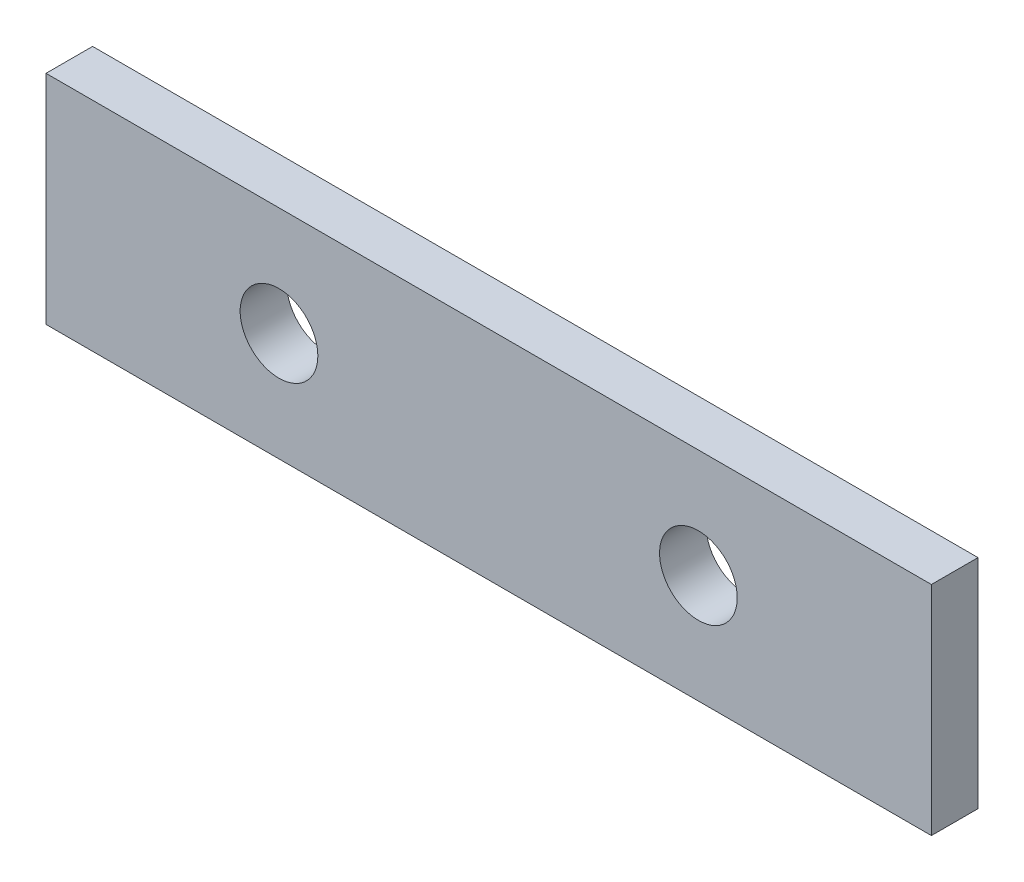
ISO-10303-21;
HEADER;
FILE_DESCRIPTION(('STEP AP214'),'2;1');
FILE_NAME('part.step','',(''),(''),'','','');
FILE_SCHEMA(('AUTOMOTIVE_DESIGN { 1 0 10303 214 1 1 1 1 }'));
ENDSEC;
DATA;
#1=APPLICATION_CONTEXT('core data for automotive mechanical design processes');
#2=APPLICATION_PROTOCOL_DEFINITION('international standard','automotive_design',2000,#1);
#3=PRODUCT_CONTEXT('',#1,'mechanical');
#4=PRODUCT('Part','Part','',(#3));
#5=PRODUCT_RELATED_PRODUCT_CATEGORY('part','',(#4));
#6=PRODUCT_DEFINITION_FORMATION('','',#4);
#7=PRODUCT_DEFINITION_CONTEXT('part definition',#1,'design');
#8=PRODUCT_DEFINITION('design','',#6,#7);
#9=PRODUCT_DEFINITION_SHAPE('','',#8);
#10=(LENGTH_UNIT() NAMED_UNIT(*) SI_UNIT(.MILLI.,.METRE.));
#11=(NAMED_UNIT(*) PLANE_ANGLE_UNIT() SI_UNIT($,.RADIAN.));
#12=(NAMED_UNIT(*) SI_UNIT($,.STERADIAN.) SOLID_ANGLE_UNIT());
#13=UNCERTAINTY_MEASURE_WITH_UNIT(LENGTH_MEASURE(1.E-05),#10,'distance_accuracy_value','');
#14=(GEOMETRIC_REPRESENTATION_CONTEXT(3) GLOBAL_UNCERTAINTY_ASSIGNED_CONTEXT((#13)) GLOBAL_UNIT_ASSIGNED_CONTEXT((#10,
#11,#12)) REPRESENTATION_CONTEXT('',''));
#15=CARTESIAN_POINT('',(0.,0.,0.));
#16=DIRECTION('',(0.,0.,1.));
#17=DIRECTION('',(1.,0.,0.));
#18=AXIS2_PLACEMENT_3D('',#15,#16,#17);
#19=CARTESIAN_POINT('',(0.,0.,3.));
#20=DIRECTION('',(0.,0.,1.));
#21=DIRECTION('',(1.,0.,0.));
#22=AXIS2_PLACEMENT_3D('',#19,#20,#21);
#23=PLANE('',#22);
#24=CARTESIAN_POINT('',(1295.66961762769,-729.830653672117,3.));
#25=DIRECTION('',(0.,0.,1.));
#26=DIRECTION('',(1.,0.,0.));
#27=AXIS2_PLACEMENT_3D('',#24,#25,#26);
#28=CIRCLE('',#27,2.50000000000059);
#29=CARTESIAN_POINT('',(1298.16961762769,-729.830653672117,3.));
#30=VERTEX_POINT('',#29);
#31=EDGE_CURVE('E99',#30,#30,#28,.T.);
#32=ORIENTED_EDGE('',*,*,#31,.F.);
#33=EDGE_LOOP('',(#32));
#34=FACE_BOUND('',#33,.T.);
#35=DIRECTION('',(1.,0.,0.));
#36=VECTOR('',#35,1.);
#37=CARTESIAN_POINT('',(1280.66961762769,-736.830653672117,3.));
#38=LINE('',#37,#36);
#39=CARTESIAN_POINT('',(1280.66961762769,-736.830653672117,3.));
#40=VERTEX_POINT('',#39);
#41=CARTESIAN_POINT('',(1337.66961762769,-736.830653672117,3.));
#42=VERTEX_POINT('',#41);
#43=EDGE_CURVE('E84',#40,#42,#38,.T.);
#44=ORIENTED_EDGE('',*,*,#43,.T.);
#45=DIRECTION('',(0.,1.,0.));
#46=VECTOR('',#45,1.);
#47=CARTESIAN_POINT('',(1337.66961762769,-736.830653672117,3.));
#48=LINE('',#47,#46);
#49=CARTESIAN_POINT('',(1337.66961762769,-722.830653672117,3.));
#50=VERTEX_POINT('',#49);
#51=EDGE_CURVE('E79',#42,#50,#48,.T.);
#52=ORIENTED_EDGE('',*,*,#51,.T.);
#53=DIRECTION('',(-1.,0.,0.));
#54=VECTOR('',#53,1.);
#55=CARTESIAN_POINT('',(1280.66961762769,-722.830653672117,3.));
#56=LINE('',#55,#54);
#57=CARTESIAN_POINT('',(1280.66961762769,-722.830653672117,3.));
#58=VERTEX_POINT('',#57);
#59=EDGE_CURVE('E82',#50,#58,#56,.T.);
#60=ORIENTED_EDGE('',*,*,#59,.T.);
#61=DIRECTION('',(0.,-1.,0.));
#62=VECTOR('',#61,1.);
#63=CARTESIAN_POINT('',(1280.66961762769,-722.830653672117,3.));
#64=LINE('',#63,#62);
#65=EDGE_CURVE('E49',#58,#40,#64,.T.);
#66=ORIENTED_EDGE('',*,*,#65,.T.);
#67=EDGE_LOOP('',(#44,#52,#60,#66));
#68=FACE_BOUND('',#67,.T.);
#69=CARTESIAN_POINT('',(1322.66961762769,-729.830653672117,3.));
#70=DIRECTION('',(0.,0.,1.));
#71=DIRECTION('',(1.,0.,0.));
#72=AXIS2_PLACEMENT_3D('',#69,#70,#71);
#73=CIRCLE('',#72,2.50000000000059);
#74=CARTESIAN_POINT('',(1325.16961762769,-729.830653672117,3.));
#75=VERTEX_POINT('',#74);
#76=EDGE_CURVE('E114',#75,#75,#73,.T.);
#77=ORIENTED_EDGE('',*,*,#76,.F.);
#78=EDGE_LOOP('',(#77));
#79=FACE_BOUND('',#78,.T.);
#80=ADVANCED_FACE('F32',(#34,#68,#79),#23,.T.);
#81=CARTESIAN_POINT('',(0.,0.,0.));
#82=DIRECTION('',(0.,0.,1.));
#83=DIRECTION('',(1.,0.,0.));
#84=AXIS2_PLACEMENT_3D('',#81,#82,#83);
#85=PLANE('',#84);
#86=DIRECTION('',(1.,0.,0.));
#87=VECTOR('',#86,1.);
#88=CARTESIAN_POINT('',(1280.66961762769,-736.830653672117,0.));
#89=LINE('',#88,#87);
#90=CARTESIAN_POINT('',(1280.66961762769,-736.830653672117,0.));
#91=VERTEX_POINT('',#90);
#92=CARTESIAN_POINT('',(1337.66961762769,-736.830653672117,0.));
#93=VERTEX_POINT('',#92);
#94=EDGE_CURVE('E96',#91,#93,#89,.T.);
#95=ORIENTED_EDGE('',*,*,#94,.F.);
#96=DIRECTION('',(0.,-1.,0.));
#97=VECTOR('',#96,1.);
#98=CARTESIAN_POINT('',(1280.66961762769,-722.830653672117,0.));
#99=LINE('',#98,#97);
#100=CARTESIAN_POINT('',(1280.66961762769,-722.830653672117,0.));
#101=VERTEX_POINT('',#100);
#102=EDGE_CURVE('E72',#101,#91,#99,.T.);
#103=ORIENTED_EDGE('',*,*,#102,.F.);
#104=DIRECTION('',(-1.,0.,0.));
#105=VECTOR('',#104,1.);
#106=CARTESIAN_POINT('',(1280.66961762769,-722.830653672117,0.));
#107=LINE('',#106,#105);
#108=CARTESIAN_POINT('',(1337.66961762769,-722.830653672117,0.));
#109=VERTEX_POINT('',#108);
#110=EDGE_CURVE('E66',#109,#101,#107,.T.);
#111=ORIENTED_EDGE('',*,*,#110,.F.);
#112=DIRECTION('',(0.,1.,0.));
#113=VECTOR('',#112,1.);
#114=CARTESIAN_POINT('',(1337.66961762769,-736.830653672117,0.));
#115=LINE('',#114,#113);
#116=EDGE_CURVE('E88',#93,#109,#115,.T.);
#117=ORIENTED_EDGE('',*,*,#116,.F.);
#118=EDGE_LOOP('',(#95,#103,#111,#117));
#119=FACE_BOUND('',#118,.T.);
#120=CARTESIAN_POINT('',(1295.66961762769,-729.830653672117,0.));
#121=DIRECTION('',(0.,0.,1.));
#122=DIRECTION('',(1.,0.,0.));
#123=AXIS2_PLACEMENT_3D('',#120,#121,#122);
#124=CIRCLE('',#123,2.50000000000059);
#125=CARTESIAN_POINT('',(1298.16961762769,-729.830653672117,0.));
#126=VERTEX_POINT('',#125);
#127=EDGE_CURVE('E111',#126,#126,#124,.T.);
#128=ORIENTED_EDGE('',*,*,#127,.T.);
#129=EDGE_LOOP('',(#128));
#130=FACE_BOUND('',#129,.T.);
#131=CARTESIAN_POINT('',(1322.66961762769,-729.830653672117,0.));
#132=DIRECTION('',(0.,0.,1.));
#133=DIRECTION('',(1.,0.,0.));
#134=AXIS2_PLACEMENT_3D('',#131,#132,#133);
#135=CIRCLE('',#134,2.50000000000059);
#136=CARTESIAN_POINT('',(1325.16961762769,-729.830653672117,0.));
#137=VERTEX_POINT('',#136);
#138=EDGE_CURVE('E117',#137,#137,#135,.T.);
#139=ORIENTED_EDGE('',*,*,#138,.T.);
#140=EDGE_LOOP('',(#139));
#141=FACE_BOUND('',#140,.T.);
#142=ADVANCED_FACE('F107',(#119,#130,#141),#85,.F.);
#143=CARTESIAN_POINT('',(1280.66961762769,-736.830653672117,3.));
#144=DIRECTION('',(0.,1.,0.));
#145=DIRECTION('',(0.,0.,1.));
#146=AXIS2_PLACEMENT_3D('',#143,#144,#145);
#147=PLANE('',#146);
#148=ORIENTED_EDGE('',*,*,#94,.T.);
#149=DIRECTION('',(0.,0.,-1.));
#150=VECTOR('',#149,1.);
#151=CARTESIAN_POINT('',(1337.66961762769,-736.830653672117,3.));
#152=LINE('',#151,#150);
#153=EDGE_CURVE('E11',#42,#93,#152,.T.);
#154=ORIENTED_EDGE('',*,*,#153,.F.);
#155=ORIENTED_EDGE('',*,*,#43,.F.);
#156=DIRECTION('',(0.,0.,-1.));
#157=VECTOR('',#156,1.);
#158=CARTESIAN_POINT('',(1280.66961762769,-736.830653672117,3.));
#159=LINE('',#158,#157);
#160=EDGE_CURVE('E92',#40,#91,#159,.T.);
#161=ORIENTED_EDGE('',*,*,#160,.T.);
#162=EDGE_LOOP('',(#148,#154,#155,#161));
#163=FACE_BOUND('',#162,.T.);
#164=ADVANCED_FACE('F34',(#163),#147,.F.);
#165=CARTESIAN_POINT('',(1337.66961762769,-736.830653672117,3.));
#166=DIRECTION('',(-1.,0.,0.));
#167=DIRECTION('',(0.,0.,1.));
#168=AXIS2_PLACEMENT_3D('',#165,#166,#167);
#169=PLANE('',#168);
#170=ORIENTED_EDGE('',*,*,#116,.T.);
#171=DIRECTION('',(0.,0.,-1.));
#172=VECTOR('',#171,1.);
#173=CARTESIAN_POINT('',(1337.66961762769,-722.830653672117,3.));
#174=LINE('',#173,#172);
#175=EDGE_CURVE('E41',#50,#109,#174,.T.);
#176=ORIENTED_EDGE('',*,*,#175,.F.);
#177=ORIENTED_EDGE('',*,*,#51,.F.);
#178=ORIENTED_EDGE('',*,*,#153,.T.);
#179=EDGE_LOOP('',(#170,#176,#177,#178));
#180=FACE_BOUND('',#179,.T.);
#181=ADVANCED_FACE('F87',(#180),#169,.F.);
#182=CARTESIAN_POINT('',(1280.66961762769,-722.830653672117,3.));
#183=DIRECTION('',(0.,-1.,0.));
#184=DIRECTION('',(1.,0.,0.));
#185=AXIS2_PLACEMENT_3D('',#182,#183,#184);
#186=PLANE('',#185);
#187=ORIENTED_EDGE('',*,*,#110,.T.);
#188=DIRECTION('',(0.,0.,-1.));
#189=VECTOR('',#188,1.);
#190=CARTESIAN_POINT('',(1280.66961762769,-722.830653672117,3.));
#191=LINE('',#190,#189);
#192=EDGE_CURVE('E89',#58,#101,#191,.T.);
#193=ORIENTED_EDGE('',*,*,#192,.F.);
#194=ORIENTED_EDGE('',*,*,#59,.F.);
#195=ORIENTED_EDGE('',*,*,#175,.T.);
#196=EDGE_LOOP('',(#187,#193,#194,#195));
#197=FACE_BOUND('',#196,.T.);
#198=ADVANCED_FACE('F90',(#197),#186,.F.);
#199=CARTESIAN_POINT('',(1280.66961762769,-722.830653672117,3.));
#200=DIRECTION('',(1.,0.,0.));
#201=DIRECTION('',(0.,0.,-1.));
#202=AXIS2_PLACEMENT_3D('',#199,#200,#201);
#203=PLANE('',#202);
#204=ORIENTED_EDGE('',*,*,#102,.T.);
#205=ORIENTED_EDGE('',*,*,#160,.F.);
#206=ORIENTED_EDGE('',*,*,#65,.F.);
#207=ORIENTED_EDGE('',*,*,#192,.T.);
#208=EDGE_LOOP('',(#204,#205,#206,#207));
#209=FACE_BOUND('',#208,.T.);
#210=ADVANCED_FACE('F104',(#209),#203,.F.);
#211=CARTESIAN_POINT('',(1295.66961762769,-729.830653672117,3.));
#212=DIRECTION('',(0.,0.,-1.));
#213=DIRECTION('',(-1.,0.,0.));
#214=AXIS2_PLACEMENT_3D('',#211,#212,#213);
#215=CYLINDRICAL_SURFACE('',#214,2.50000000000059);
#216=ORIENTED_EDGE('',*,*,#31,.T.);
#217=EDGE_LOOP('',(#216));
#218=FACE_BOUND('',#217,.T.);
#219=ORIENTED_EDGE('',*,*,#127,.F.);
#220=EDGE_LOOP('',(#219));
#221=FACE_BOUND('',#220,.T.);
#222=ADVANCED_FACE('F134',(#218,#221),#215,.F.);
#223=CARTESIAN_POINT('',(1322.66961762769,-729.830653672117,3.));
#224=DIRECTION('',(0.,0.,-1.));
#225=DIRECTION('',(-1.,0.,0.));
#226=AXIS2_PLACEMENT_3D('',#223,#224,#225);
#227=CYLINDRICAL_SURFACE('',#226,2.50000000000059);
#228=ORIENTED_EDGE('',*,*,#76,.T.);
#229=EDGE_LOOP('',(#228));
#230=FACE_BOUND('',#229,.T.);
#231=ORIENTED_EDGE('',*,*,#138,.F.);
#232=EDGE_LOOP('',(#231));
#233=FACE_BOUND('',#232,.T.);
#234=ADVANCED_FACE('F123',(#230,#233),#227,.F.);
#235=CLOSED_SHELL('',(#80,#142,#164,#181,#198,#210,#222,#234));
#236=MANIFOLD_SOLID_BREP('B2',#235);
#237=ADVANCED_BREP_SHAPE_REPRESENTATION('',(#18,#236),#14);
#238=SHAPE_DEFINITION_REPRESENTATION(#9,#237);
ENDSEC;
END-ISO-10303-21;
